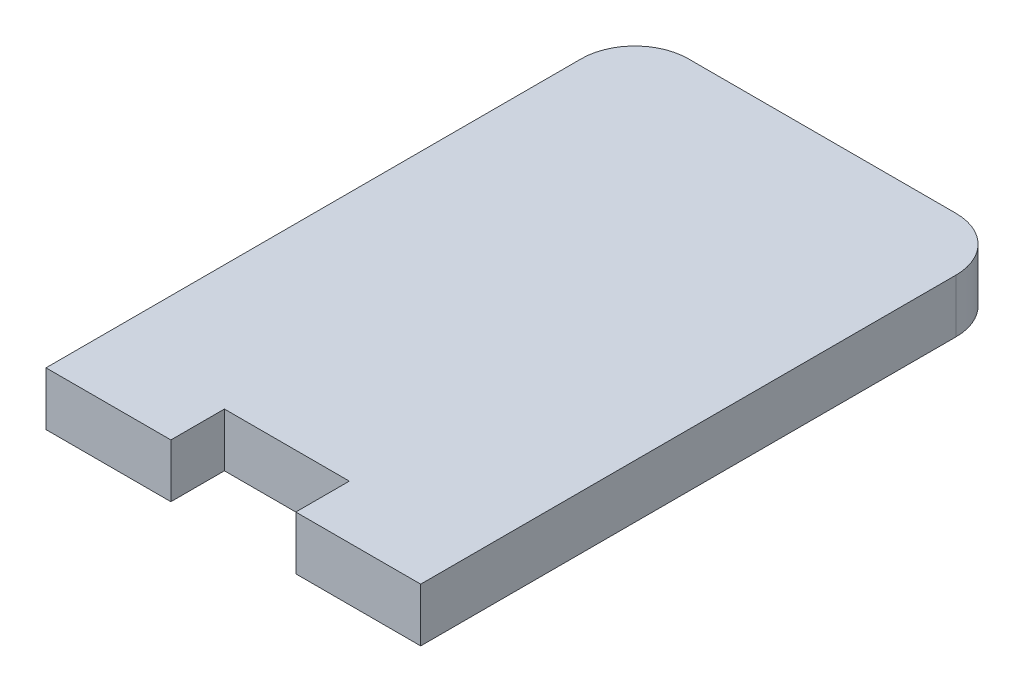
ISO-10303-21;
HEADER;
FILE_DESCRIPTION(('STEP AP214'),'2;1');
FILE_NAME('part.step','',(''),(''),'','','');
FILE_SCHEMA(('AUTOMOTIVE_DESIGN { 1 0 10303 214 1 1 1 1 }'));
ENDSEC;
DATA;
#1=APPLICATION_CONTEXT('core data for automotive mechanical design processes');
#2=APPLICATION_PROTOCOL_DEFINITION('international standard','automotive_design',2000,#1);
#3=PRODUCT_CONTEXT('',#1,'mechanical');
#4=PRODUCT('Part','Part','',(#3));
#5=PRODUCT_RELATED_PRODUCT_CATEGORY('part','',(#4));
#6=PRODUCT_DEFINITION_FORMATION('','',#4);
#7=PRODUCT_DEFINITION_CONTEXT('part definition',#1,'design');
#8=PRODUCT_DEFINITION('design','',#6,#7);
#9=PRODUCT_DEFINITION_SHAPE('','',#8);
#10=(LENGTH_UNIT() NAMED_UNIT(*) SI_UNIT(.MILLI.,.METRE.));
#11=(NAMED_UNIT(*) PLANE_ANGLE_UNIT() SI_UNIT($,.RADIAN.));
#12=(NAMED_UNIT(*) SI_UNIT($,.STERADIAN.) SOLID_ANGLE_UNIT());
#13=UNCERTAINTY_MEASURE_WITH_UNIT(LENGTH_MEASURE(1.E-05),#10,'distance_accuracy_value','');
#14=(GEOMETRIC_REPRESENTATION_CONTEXT(3) GLOBAL_UNCERTAINTY_ASSIGNED_CONTEXT((#13)) GLOBAL_UNIT_ASSIGNED_CONTEXT((#10,
#11,#12)) REPRESENTATION_CONTEXT('',''));
#15=CARTESIAN_POINT('',(0.,0.,0.));
#16=DIRECTION('',(0.,0.,1.));
#17=DIRECTION('',(1.,0.,0.));
#18=AXIS2_PLACEMENT_3D('',#15,#16,#17);
#19=CARTESIAN_POINT('',(-10.5,3.,16.5));
#20=DIRECTION('',(0.,0.,-1.));
#21=DIRECTION('',(-1.,0.,0.));
#22=AXIS2_PLACEMENT_3D('',#19,#20,#21);
#23=PLANE('',#22);
#24=DIRECTION('',(1.,0.,0.));
#25=VECTOR('',#24,1.);
#26=CARTESIAN_POINT('',(-10.5,0.,16.5));
#27=LINE('',#26,#25);
#28=CARTESIAN_POINT('',(-10.5,0.,16.5));
#29=VERTEX_POINT('',#28);
#30=CARTESIAN_POINT('',(-3.5,0.,16.5));
#31=VERTEX_POINT('',#30);
#32=EDGE_CURVE('E127',#29,#31,#27,.T.);
#33=ORIENTED_EDGE('',*,*,#32,.T.);
#34=DIRECTION('',(0.,1.,0.));
#35=VECTOR('',#34,1.);
#36=CARTESIAN_POINT('',(-3.5,0.,16.5));
#37=LINE('',#36,#35);
#38=CARTESIAN_POINT('',(-3.5,3.,16.5));
#39=VERTEX_POINT('',#38);
#40=EDGE_CURVE('E110',#31,#39,#37,.T.);
#41=ORIENTED_EDGE('',*,*,#40,.T.);
#42=DIRECTION('',(1.,0.,0.));
#43=VECTOR('',#42,1.);
#44=CARTESIAN_POINT('',(-10.5,3.,16.5));
#45=LINE('',#44,#43);
#46=CARTESIAN_POINT('',(-10.5,3.,16.5));
#47=VERTEX_POINT('',#46);
#48=EDGE_CURVE('E147',#47,#39,#45,.T.);
#49=ORIENTED_EDGE('',*,*,#48,.F.);
#50=DIRECTION('',(0.,-1.,0.));
#51=VECTOR('',#50,1.);
#52=CARTESIAN_POINT('',(-10.5,3.,16.5));
#53=LINE('',#52,#51);
#54=EDGE_CURVE('E134',#47,#29,#53,.T.);
#55=ORIENTED_EDGE('',*,*,#54,.T.);
#56=EDGE_LOOP('',(#33,#41,#49,#55));
#57=FACE_BOUND('',#56,.T.);
#58=ADVANCED_FACE('F33',(#57),#23,.F.);
#59=CARTESIAN_POINT('',(10.5,3.,16.5));
#60=DIRECTION('',(-1.,0.,0.));
#61=DIRECTION('',(0.,0.,1.));
#62=AXIS2_PLACEMENT_3D('',#59,#60,#61);
#63=PLANE('',#62);
#64=DIRECTION('',(0.,0.,-1.));
#65=VECTOR('',#64,1.);
#66=CARTESIAN_POINT('',(10.5,0.,16.5));
#67=LINE('',#66,#65);
#68=CARTESIAN_POINT('',(10.5,0.,16.5));
#69=VERTEX_POINT('',#68);
#70=CARTESIAN_POINT('',(10.5,0.,-13.5));
#71=VERTEX_POINT('',#70);
#72=EDGE_CURVE('E171',#69,#71,#67,.T.);
#73=ORIENTED_EDGE('',*,*,#72,.T.);
#74=DIRECTION('',(0.,-1.,0.));
#75=VECTOR('',#74,1.);
#76=CARTESIAN_POINT('',(10.5,3.,-13.5));
#77=LINE('',#76,#75);
#78=CARTESIAN_POINT('',(10.5,3.,-13.5));
#79=VERTEX_POINT('',#78);
#80=EDGE_CURVE('E41',#71,#79,#77,.F.);
#81=ORIENTED_EDGE('',*,*,#80,.T.);
#82=DIRECTION('',(0.,0.,-1.));
#83=VECTOR('',#82,1.);
#84=CARTESIAN_POINT('',(10.5,3.,16.5));
#85=LINE('',#84,#83);
#86=CARTESIAN_POINT('',(10.5,3.,16.5));
#87=VERTEX_POINT('',#86);
#88=EDGE_CURVE('E135',#87,#79,#85,.T.);
#89=ORIENTED_EDGE('',*,*,#88,.F.);
#90=DIRECTION('',(0.,-1.,0.));
#91=VECTOR('',#90,1.);
#92=CARTESIAN_POINT('',(10.5,3.,16.5));
#93=LINE('',#92,#91);
#94=EDGE_CURVE('E144',#87,#69,#93,.T.);
#95=ORIENTED_EDGE('',*,*,#94,.T.);
#96=EDGE_LOOP('',(#73,#81,#89,#95));
#97=FACE_BOUND('',#96,.T.);
#98=ADVANCED_FACE('F216',(#97),#63,.F.);
#99=CARTESIAN_POINT('',(-10.5,3.,-16.5));
#100=DIRECTION('',(0.,0.,1.));
#101=DIRECTION('',(1.,0.,0.));
#102=AXIS2_PLACEMENT_3D('',#99,#100,#101);
#103=PLANE('',#102);
#104=DIRECTION('',(-1.,0.,0.));
#105=VECTOR('',#104,1.);
#106=CARTESIAN_POINT('',(-10.5,3.,-16.5));
#107=LINE('',#106,#105);
#108=CARTESIAN_POINT('',(7.49999999999999,3.,-16.5));
#109=VERTEX_POINT('',#108);
#110=CARTESIAN_POINT('',(-7.5,3.,-16.5));
#111=VERTEX_POINT('',#110);
#112=EDGE_CURVE('E138',#109,#111,#107,.T.);
#113=ORIENTED_EDGE('',*,*,#112,.F.);
#114=DIRECTION('',(0.,-1.,0.));
#115=VECTOR('',#114,1.);
#116=CARTESIAN_POINT('',(7.5,3.,-16.5));
#117=LINE('',#116,#115);
#118=CARTESIAN_POINT('',(7.49999999999999,0.,-16.5));
#119=VERTEX_POINT('',#118);
#120=EDGE_CURVE('E160',#109,#119,#117,.T.);
#121=ORIENTED_EDGE('',*,*,#120,.T.);
#122=DIRECTION('',(-1.,0.,0.));
#123=VECTOR('',#122,1.);
#124=CARTESIAN_POINT('',(-10.5,0.,-16.5));
#125=LINE('',#124,#123);
#126=CARTESIAN_POINT('',(-7.5,0.,-16.5));
#127=VERTEX_POINT('',#126);
#128=EDGE_CURVE('E167',#119,#127,#125,.T.);
#129=ORIENTED_EDGE('',*,*,#128,.T.);
#130=DIRECTION('',(0.,-1.,0.));
#131=VECTOR('',#130,1.);
#132=CARTESIAN_POINT('',(-7.5,3.,-16.5));
#133=LINE('',#132,#131);
#134=EDGE_CURVE('E155',#127,#111,#133,.F.);
#135=ORIENTED_EDGE('',*,*,#134,.T.);
#136=EDGE_LOOP('',(#113,#121,#129,#135));
#137=FACE_BOUND('',#136,.T.);
#138=ADVANCED_FACE('F166',(#137),#103,.F.);
#139=CARTESIAN_POINT('',(-10.5,3.,16.5));
#140=DIRECTION('',(1.,0.,0.));
#141=DIRECTION('',(0.,0.,-1.));
#142=AXIS2_PLACEMENT_3D('',#139,#140,#141);
#143=PLANE('',#142);
#144=DIRECTION('',(0.,0.,1.));
#145=VECTOR('',#144,1.);
#146=CARTESIAN_POINT('',(-10.5,3.,16.5));
#147=LINE('',#146,#145);
#148=CARTESIAN_POINT('',(-10.5,3.,-13.5));
#149=VERTEX_POINT('',#148);
#150=EDGE_CURVE('E177',#149,#47,#147,.T.);
#151=ORIENTED_EDGE('',*,*,#150,.F.);
#152=DIRECTION('',(0.,-1.,0.));
#153=VECTOR('',#152,1.);
#154=CARTESIAN_POINT('',(-10.5,3.,-13.5));
#155=LINE('',#154,#153);
#156=CARTESIAN_POINT('',(-10.5,0.,-13.5));
#157=VERTEX_POINT('',#156);
#158=EDGE_CURVE('E149',#149,#157,#155,.T.);
#159=ORIENTED_EDGE('',*,*,#158,.T.);
#160=DIRECTION('',(0.,0.,1.));
#161=VECTOR('',#160,1.);
#162=CARTESIAN_POINT('',(-10.5,0.,16.5));
#163=LINE('',#162,#161);
#164=EDGE_CURVE('E140',#157,#29,#163,.T.);
#165=ORIENTED_EDGE('',*,*,#164,.T.);
#166=ORIENTED_EDGE('',*,*,#54,.F.);
#167=EDGE_LOOP('',(#151,#159,#165,#166));
#168=FACE_BOUND('',#167,.T.);
#169=ADVANCED_FACE('F225',(#168),#143,.F.);
#170=CARTESIAN_POINT('',(3.5,3.,16.5));
#171=VERTEX_POINT('',#170);
#172=EDGE_CURVE('E176',#171,#87,#45,.T.);
#173=ORIENTED_EDGE('',*,*,#172,.F.);
#174=DIRECTION('',(0.,1.,0.));
#175=VECTOR('',#174,1.);
#176=CARTESIAN_POINT('',(3.5,0.,16.5));
#177=LINE('',#176,#175);
#178=CARTESIAN_POINT('',(3.5,0.,16.5));
#179=VERTEX_POINT('',#178);
#180=EDGE_CURVE('E121',#179,#171,#177,.T.);
#181=ORIENTED_EDGE('',*,*,#180,.F.);
#182=EDGE_CURVE('E136',#179,#69,#27,.T.);
#183=ORIENTED_EDGE('',*,*,#182,.T.);
#184=ORIENTED_EDGE('',*,*,#94,.F.);
#185=EDGE_LOOP('',(#173,#181,#183,#184));
#186=FACE_BOUND('',#185,.T.);
#187=ADVANCED_FACE('F199',(#186),#23,.F.);
#188=CARTESIAN_POINT('',(0.,3.,0.));
#189=DIRECTION('',(0.,-1.,0.));
#190=DIRECTION('',(0.,0.,-1.));
#191=AXIS2_PLACEMENT_3D('',#188,#189,#190);
#192=PLANE('',#191);
#193=ORIENTED_EDGE('',*,*,#88,.T.);
#194=CARTESIAN_POINT('',(7.5,3.,-13.5));
#195=DIRECTION('',(0.,-1.,0.));
#196=DIRECTION('',(0.,0.,-1.));
#197=AXIS2_PLACEMENT_3D('',#194,#195,#196);
#198=CIRCLE('',#197,3.);
#199=EDGE_CURVE('E11',#79,#109,#198,.F.);
#200=ORIENTED_EDGE('',*,*,#199,.T.);
#201=ORIENTED_EDGE('',*,*,#112,.T.);
#202=CARTESIAN_POINT('',(-7.5,3.,-13.5));
#203=DIRECTION('',(0.,-1.,0.));
#204=DIRECTION('',(0.,0.,-1.));
#205=AXIS2_PLACEMENT_3D('',#202,#203,#204);
#206=CIRCLE('',#205,3.);
#207=EDGE_CURVE('E158',#111,#149,#206,.F.);
#208=ORIENTED_EDGE('',*,*,#207,.T.);
#209=ORIENTED_EDGE('',*,*,#150,.T.);
#210=ORIENTED_EDGE('',*,*,#48,.T.);
#211=DIRECTION('',(0.,0.,1.));
#212=VECTOR('',#211,1.);
#213=CARTESIAN_POINT('',(-3.5,3.,16.5));
#214=LINE('',#213,#212);
#215=CARTESIAN_POINT('',(-3.5,3.,13.5));
#216=VERTEX_POINT('',#215);
#217=EDGE_CURVE('E116',#216,#39,#214,.T.);
#218=ORIENTED_EDGE('',*,*,#217,.F.);
#219=DIRECTION('',(-1.,0.,0.));
#220=VECTOR('',#219,1.);
#221=CARTESIAN_POINT('',(-3.5,3.,13.5));
#222=LINE('',#221,#220);
#223=CARTESIAN_POINT('',(3.5,3.,13.5));
#224=VERTEX_POINT('',#223);
#225=EDGE_CURVE('E130',#224,#216,#222,.T.);
#226=ORIENTED_EDGE('',*,*,#225,.F.);
#227=DIRECTION('',(0.,0.,-1.));
#228=VECTOR('',#227,1.);
#229=CARTESIAN_POINT('',(3.5,3.,16.5));
#230=LINE('',#229,#228);
#231=EDGE_CURVE('E186',#171,#224,#230,.T.);
#232=ORIENTED_EDGE('',*,*,#231,.F.);
#233=ORIENTED_EDGE('',*,*,#172,.T.);
#234=EDGE_LOOP('',(#193,#200,#201,#208,#209,#210,#218,#226,#232,#233));
#235=FACE_BOUND('',#234,.T.);
#236=ADVANCED_FACE('F202',(#235),#192,.F.);
#237=CARTESIAN_POINT('',(0.,0.,0.));
#238=DIRECTION('',(0.,-1.,0.));
#239=DIRECTION('',(0.,0.,-1.));
#240=AXIS2_PLACEMENT_3D('',#237,#238,#239);
#241=PLANE('',#240);
#242=ORIENTED_EDGE('',*,*,#128,.F.);
#243=CARTESIAN_POINT('',(7.5,0.,-13.5));
#244=DIRECTION('',(0.,-1.,0.));
#245=DIRECTION('',(0.,0.,-1.));
#246=AXIS2_PLACEMENT_3D('',#243,#244,#245);
#247=CIRCLE('',#246,3.);
#248=EDGE_CURVE('E55',#119,#71,#247,.T.);
#249=ORIENTED_EDGE('',*,*,#248,.T.);
#250=ORIENTED_EDGE('',*,*,#72,.F.);
#251=ORIENTED_EDGE('',*,*,#182,.F.);
#252=DIRECTION('',(0.,0.,-1.));
#253=VECTOR('',#252,1.);
#254=CARTESIAN_POINT('',(3.5,0.,16.5));
#255=LINE('',#254,#253);
#256=CARTESIAN_POINT('',(3.5,0.,13.5));
#257=VERTEX_POINT('',#256);
#258=EDGE_CURVE('E129',#179,#257,#255,.T.);
#259=ORIENTED_EDGE('',*,*,#258,.T.);
#260=DIRECTION('',(-1.,0.,0.));
#261=VECTOR('',#260,1.);
#262=CARTESIAN_POINT('',(-3.5,0.,13.5));
#263=LINE('',#262,#261);
#264=CARTESIAN_POINT('',(-3.5,0.,13.5));
#265=VERTEX_POINT('',#264);
#266=EDGE_CURVE('E122',#257,#265,#263,.T.);
#267=ORIENTED_EDGE('',*,*,#266,.T.);
#268=DIRECTION('',(0.,0.,1.));
#269=VECTOR('',#268,1.);
#270=CARTESIAN_POINT('',(-3.5,0.,16.5));
#271=LINE('',#270,#269);
#272=EDGE_CURVE('E113',#265,#31,#271,.T.);
#273=ORIENTED_EDGE('',*,*,#272,.T.);
#274=ORIENTED_EDGE('',*,*,#32,.F.);
#275=ORIENTED_EDGE('',*,*,#164,.F.);
#276=CARTESIAN_POINT('',(-7.5,0.,-13.5));
#277=DIRECTION('',(0.,-1.,0.));
#278=DIRECTION('',(0.,0.,-1.));
#279=AXIS2_PLACEMENT_3D('',#276,#277,#278);
#280=CIRCLE('',#279,3.);
#281=EDGE_CURVE('E152',#157,#127,#280,.T.);
#282=ORIENTED_EDGE('',*,*,#281,.T.);
#283=EDGE_LOOP('',(#242,#249,#250,#251,#259,#267,#273,#274,#275,#282));
#284=FACE_BOUND('',#283,.T.);
#285=ADVANCED_FACE('F125',(#284),#241,.T.);
#286=CARTESIAN_POINT('',(-3.5,0.,16.5));
#287=DIRECTION('',(-1.,0.,0.));
#288=DIRECTION('',(0.,0.,1.));
#289=AXIS2_PLACEMENT_3D('',#286,#287,#288);
#290=PLANE('',#289);
#291=ORIENTED_EDGE('',*,*,#217,.T.);
#292=ORIENTED_EDGE('',*,*,#40,.F.);
#293=ORIENTED_EDGE('',*,*,#272,.F.);
#294=DIRECTION('',(0.,1.,0.));
#295=VECTOR('',#294,1.);
#296=CARTESIAN_POINT('',(-3.5,0.,13.5));
#297=LINE('',#296,#295);
#298=EDGE_CURVE('E172',#265,#216,#297,.T.);
#299=ORIENTED_EDGE('',*,*,#298,.T.);
#300=EDGE_LOOP('',(#291,#292,#293,#299));
#301=FACE_BOUND('',#300,.T.);
#302=ADVANCED_FACE('F112',(#301),#290,.F.);
#303=CARTESIAN_POINT('',(-3.5,0.,13.5));
#304=DIRECTION('',(0.,0.,-1.));
#305=DIRECTION('',(-1.,0.,0.));
#306=AXIS2_PLACEMENT_3D('',#303,#304,#305);
#307=PLANE('',#306);
#308=ORIENTED_EDGE('',*,*,#225,.T.);
#309=ORIENTED_EDGE('',*,*,#298,.F.);
#310=ORIENTED_EDGE('',*,*,#266,.F.);
#311=DIRECTION('',(0.,1.,0.));
#312=VECTOR('',#311,1.);
#313=CARTESIAN_POINT('',(3.5,0.,13.5));
#314=LINE('',#313,#312);
#315=EDGE_CURVE('E181',#257,#224,#314,.T.);
#316=ORIENTED_EDGE('',*,*,#315,.T.);
#317=EDGE_LOOP('',(#308,#309,#310,#316));
#318=FACE_BOUND('',#317,.T.);
#319=ADVANCED_FACE('F205',(#318),#307,.F.);
#320=CARTESIAN_POINT('',(3.5,0.,16.5));
#321=DIRECTION('',(1.,0.,0.));
#322=DIRECTION('',(0.,0.,-1.));
#323=AXIS2_PLACEMENT_3D('',#320,#321,#322);
#324=PLANE('',#323);
#325=ORIENTED_EDGE('',*,*,#231,.T.);
#326=ORIENTED_EDGE('',*,*,#315,.F.);
#327=ORIENTED_EDGE('',*,*,#258,.F.);
#328=ORIENTED_EDGE('',*,*,#180,.T.);
#329=EDGE_LOOP('',(#325,#326,#327,#328));
#330=FACE_BOUND('',#329,.T.);
#331=ADVANCED_FACE('F195',(#330),#324,.F.);
#332=CARTESIAN_POINT('',(-7.5,3.,-13.5));
#333=DIRECTION('',(0.,-1.,0.));
#334=DIRECTION('',(0.,0.,-1.));
#335=AXIS2_PLACEMENT_3D('',#332,#333,#334);
#336=CYLINDRICAL_SURFACE('',#335,3.);
#337=ORIENTED_EDGE('',*,*,#207,.F.);
#338=ORIENTED_EDGE('',*,*,#134,.F.);
#339=ORIENTED_EDGE('',*,*,#281,.F.);
#340=ORIENTED_EDGE('',*,*,#158,.F.);
#341=EDGE_LOOP('',(#337,#338,#339,#340));
#342=FACE_BOUND('',#341,.T.);
#343=ADVANCED_FACE('F212',(#342),#336,.T.);
#344=CARTESIAN_POINT('',(7.5,3.,-13.5));
#345=DIRECTION('',(0.,-1.,0.));
#346=DIRECTION('',(0.,0.,-1.));
#347=AXIS2_PLACEMENT_3D('',#344,#345,#346);
#348=CYLINDRICAL_SURFACE('',#347,3.);
#349=ORIENTED_EDGE('',*,*,#199,.F.);
#350=ORIENTED_EDGE('',*,*,#80,.F.);
#351=ORIENTED_EDGE('',*,*,#248,.F.);
#352=ORIENTED_EDGE('',*,*,#120,.F.);
#353=EDGE_LOOP('',(#349,#350,#351,#352));
#354=FACE_BOUND('',#353,.T.);
#355=ADVANCED_FACE('F35',(#354),#348,.T.);
#356=CLOSED_SHELL('',(#58,#98,#138,#169,#187,#236,#285,#302,#319,#331,#343,#355));
#357=MANIFOLD_SOLID_BREP('B2',#356);
#358=ADVANCED_BREP_SHAPE_REPRESENTATION('',(#18,#357),#14);
#359=SHAPE_DEFINITION_REPRESENTATION(#9,#358);
ENDSEC;
END-ISO-10303-21;
